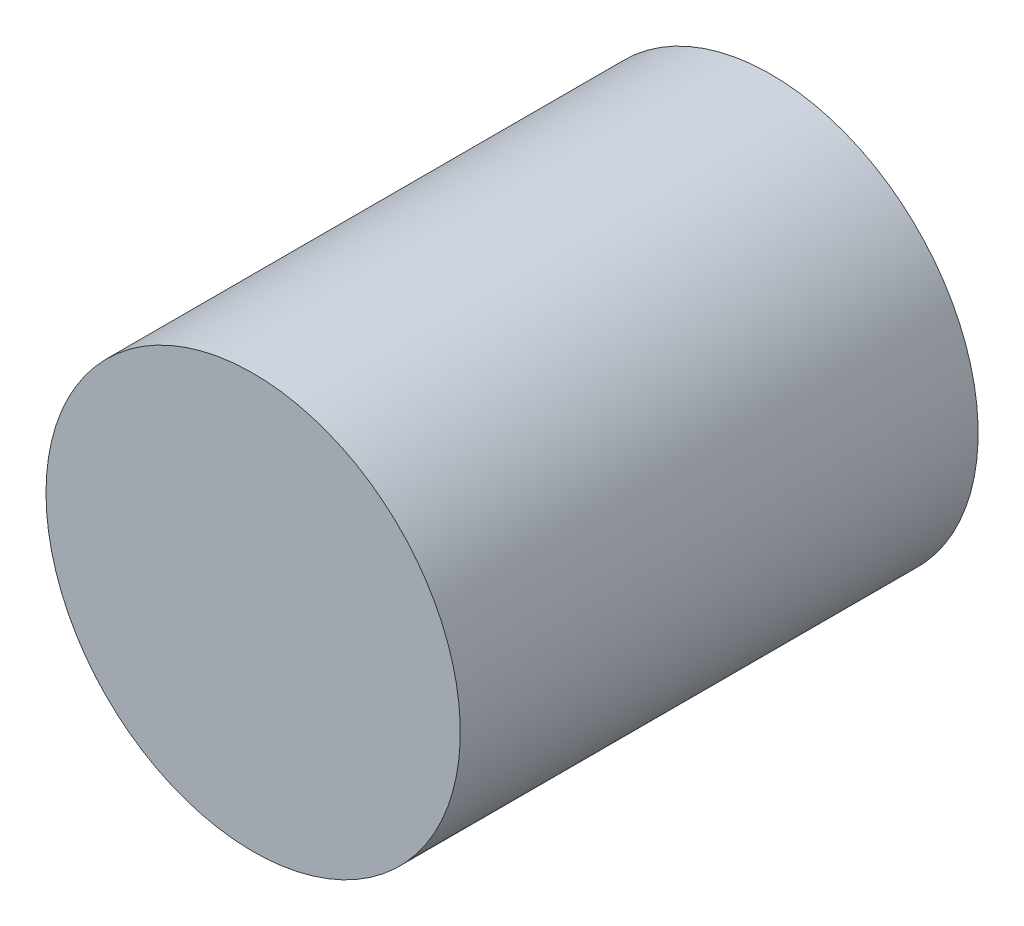
ISO-10303-21;
HEADER;
FILE_DESCRIPTION(('STEP AP214'),'2;1');
FILE_NAME('part.step','',(''),(''),'','','');
FILE_SCHEMA(('AUTOMOTIVE_DESIGN { 1 0 10303 214 1 1 1 1 }'));
ENDSEC;
DATA;
#1=APPLICATION_CONTEXT('core data for automotive mechanical design processes');
#2=APPLICATION_PROTOCOL_DEFINITION('international standard','automotive_design',2000,#1);
#3=PRODUCT_CONTEXT('',#1,'mechanical');
#4=PRODUCT('Part','Part','',(#3));
#5=PRODUCT_RELATED_PRODUCT_CATEGORY('part','',(#4));
#6=PRODUCT_DEFINITION_FORMATION('','',#4);
#7=PRODUCT_DEFINITION_CONTEXT('part definition',#1,'design');
#8=PRODUCT_DEFINITION('design','',#6,#7);
#9=PRODUCT_DEFINITION_SHAPE('','',#8);
#10=(LENGTH_UNIT() NAMED_UNIT(*) SI_UNIT(.MILLI.,.METRE.));
#11=(NAMED_UNIT(*) PLANE_ANGLE_UNIT() SI_UNIT($,.RADIAN.));
#12=(NAMED_UNIT(*) SI_UNIT($,.STERADIAN.) SOLID_ANGLE_UNIT());
#13=UNCERTAINTY_MEASURE_WITH_UNIT(LENGTH_MEASURE(1.E-05),#10,'distance_accuracy_value','');
#14=(GEOMETRIC_REPRESENTATION_CONTEXT(3) GLOBAL_UNCERTAINTY_ASSIGNED_CONTEXT((#13)) GLOBAL_UNIT_ASSIGNED_CONTEXT((#10,
#11,#12)) REPRESENTATION_CONTEXT('',''));
#15=CARTESIAN_POINT('',(0.,0.,0.));
#16=DIRECTION('',(0.,0.,1.));
#17=DIRECTION('',(1.,0.,0.));
#18=AXIS2_PLACEMENT_3D('',#15,#16,#17);
#19=CARTESIAN_POINT('',(0.80000094,0.,0.));
#20=DIRECTION('',(0.,0.,-1.));
#21=DIRECTION('',(-1.,0.,0.));
#22=AXIS2_PLACEMENT_3D('',#19,#20,#21);
#23=PLANE('',#22);
#24=CARTESIAN_POINT('',(0.,0.,0.));
#25=DIRECTION('',(0.,0.,-1.));
#26=DIRECTION('',(-1.,0.,0.));
#27=AXIS2_PLACEMENT_3D('',#24,#25,#26);
#28=CIRCLE('',#27,0.80000094);
#29=CARTESIAN_POINT('',(-0.80000094,0.,0.));
#30=VERTEX_POINT('',#29);
#31=EDGE_CURVE('E18',#30,#30,#28,.F.);
#32=ORIENTED_EDGE('',*,*,#31,.F.);
#33=EDGE_LOOP('',(#32));
#34=FACE_BOUND('',#33,.T.);
#35=ADVANCED_FACE('F15',(#34),#23,.T.);
#36=CARTESIAN_POINT('',(0.80000094,0.,2.00000108));
#37=DIRECTION('',(0.,0.,-1.));
#38=DIRECTION('',(-1.,0.,0.));
#39=AXIS2_PLACEMENT_3D('',#36,#37,#38);
#40=PLANE('',#39);
#41=CARTESIAN_POINT('',(0.,0.,2.00000108));
#42=DIRECTION('',(0.,0.,-1.));
#43=DIRECTION('',(-1.,0.,0.));
#44=AXIS2_PLACEMENT_3D('',#41,#42,#43);
#45=CIRCLE('',#44,0.80000094);
#46=CARTESIAN_POINT('',(-0.80000094,0.,2.00000108));
#47=VERTEX_POINT('',#46);
#48=EDGE_CURVE('E10',#47,#47,#45,.T.);
#49=ORIENTED_EDGE('',*,*,#48,.F.);
#50=EDGE_LOOP('',(#49));
#51=FACE_BOUND('',#50,.T.);
#52=ADVANCED_FACE('F30',(#51),#40,.F.);
#53=CARTESIAN_POINT('',(0.,0.,0.));
#54=DIRECTION('',(0.,0.,-1.));
#55=DIRECTION('',(-1.,0.,0.));
#56=AXIS2_PLACEMENT_3D('',#53,#54,#55);
#57=CYLINDRICAL_SURFACE('',#56,0.80000094);
#58=ORIENTED_EDGE('',*,*,#31,.T.);
#59=EDGE_LOOP('',(#58));
#60=FACE_BOUND('',#59,.T.);
#61=ORIENTED_EDGE('',*,*,#48,.T.);
#62=EDGE_LOOP('',(#61));
#63=FACE_BOUND('',#62,.T.);
#64=ADVANCED_FACE('F27',(#60,#63),#57,.T.);
#65=CLOSED_SHELL('',(#35,#52,#64));
#66=MANIFOLD_SOLID_BREP('B1',#65);
#67=ADVANCED_BREP_SHAPE_REPRESENTATION('',(#18,#66),#14);
#68=SHAPE_DEFINITION_REPRESENTATION(#9,#67);
ENDSEC;
END-ISO-10303-21;
